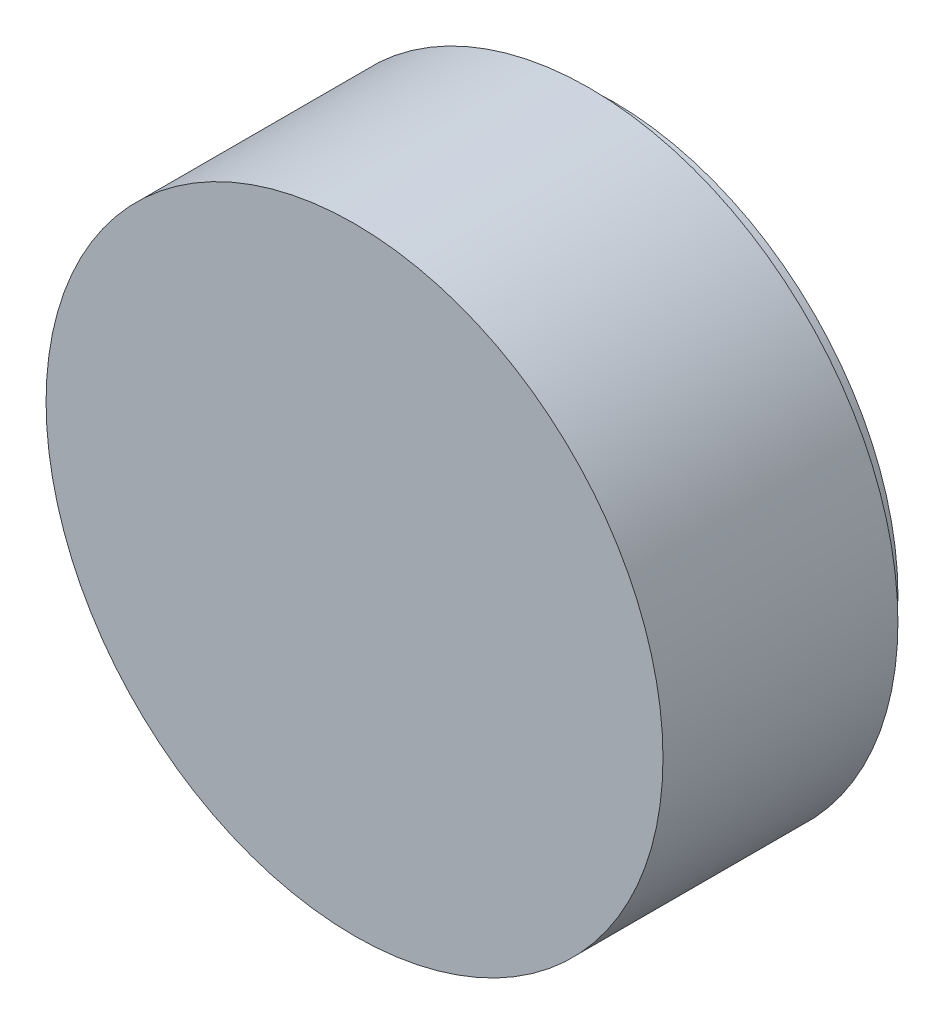
ISO-10303-21;
HEADER;
FILE_DESCRIPTION(('STEP AP214'),'2;1');
FILE_NAME('part.step','',(''),(''),'','','');
FILE_SCHEMA(('AUTOMOTIVE_DESIGN { 1 0 10303 214 1 1 1 1 }'));
ENDSEC;
DATA;
#1=APPLICATION_CONTEXT('core data for automotive mechanical design processes');
#2=APPLICATION_PROTOCOL_DEFINITION('international standard','automotive_design',2000,#1);
#3=PRODUCT_CONTEXT('',#1,'mechanical');
#4=PRODUCT('Part','Part','',(#3));
#5=PRODUCT_RELATED_PRODUCT_CATEGORY('part','',(#4));
#6=PRODUCT_DEFINITION_FORMATION('','',#4);
#7=PRODUCT_DEFINITION_CONTEXT('part definition',#1,'design');
#8=PRODUCT_DEFINITION('design','',#6,#7);
#9=PRODUCT_DEFINITION_SHAPE('','',#8);
#10=(LENGTH_UNIT() NAMED_UNIT(*) SI_UNIT(.MILLI.,.METRE.));
#11=(NAMED_UNIT(*) PLANE_ANGLE_UNIT() SI_UNIT($,.RADIAN.));
#12=(NAMED_UNIT(*) SI_UNIT($,.STERADIAN.) SOLID_ANGLE_UNIT());
#13=UNCERTAINTY_MEASURE_WITH_UNIT(LENGTH_MEASURE(1.E-05),#10,'distance_accuracy_value','');
#14=(GEOMETRIC_REPRESENTATION_CONTEXT(3) GLOBAL_UNCERTAINTY_ASSIGNED_CONTEXT((#13)) GLOBAL_UNIT_ASSIGNED_CONTEXT((#10,
#11,#12)) REPRESENTATION_CONTEXT('',''));
#15=CARTESIAN_POINT('',(0.,0.,0.));
#16=DIRECTION('',(0.,0.,1.));
#17=DIRECTION('',(1.,0.,0.));
#18=AXIS2_PLACEMENT_3D('',#15,#16,#17);
#19=CARTESIAN_POINT('',(0.,0.,2.));
#20=DIRECTION('',(0.,0.,-1.));
#21=DIRECTION('',(-1.,0.,0.));
#22=AXIS2_PLACEMENT_3D('',#19,#20,#21);
#23=CYLINDRICAL_SURFACE('',#22,24.257);
#24=CARTESIAN_POINT('',(0.,0.,2.));
#25=DIRECTION('',(0.,0.,1.));
#26=DIRECTION('',(1.,0.,0.));
#27=AXIS2_PLACEMENT_3D('',#24,#25,#26);
#28=CIRCLE('',#27,24.257);
#29=CARTESIAN_POINT('',(24.257,0.,2.));
#30=VERTEX_POINT('',#29);
#31=EDGE_CURVE('E10',#30,#30,#28,.T.);
#32=ORIENTED_EDGE('',*,*,#31,.F.);
#33=EDGE_LOOP('',(#32));
#34=FACE_BOUND('',#33,.T.);
#35=CARTESIAN_POINT('',(0.,0.,0.));
#36=DIRECTION('',(0.,0.,1.));
#37=DIRECTION('',(1.,0.,0.));
#38=AXIS2_PLACEMENT_3D('',#35,#36,#37);
#39=CIRCLE('',#38,24.257);
#40=CARTESIAN_POINT('',(24.257,0.,0.));
#41=VERTEX_POINT('',#40);
#42=EDGE_CURVE('E36',#41,#41,#39,.T.);
#43=ORIENTED_EDGE('',*,*,#42,.T.);
#44=EDGE_LOOP('',(#43));
#45=FACE_BOUND('',#44,.T.);
#46=ADVANCED_FACE('F33',(#34,#45),#23,.T.);
#47=CARTESIAN_POINT('',(0.,0.,0.));
#48=DIRECTION('',(0.,0.,1.));
#49=DIRECTION('',(1.,0.,0.));
#50=AXIS2_PLACEMENT_3D('',#47,#48,#49);
#51=PLANE('',#50);
#52=ORIENTED_EDGE('',*,*,#42,.F.);
#53=EDGE_LOOP('',(#52));
#54=FACE_BOUND('',#53,.T.);
#55=ADVANCED_FACE('F61',(#54),#51,.F.);
#56=CARTESIAN_POINT('',(0.,0.,2.));
#57=DIRECTION('',(0.,0.,1.));
#58=DIRECTION('',(1.,0.,0.));
#59=AXIS2_PLACEMENT_3D('',#56,#57,#58);
#60=PLANE('',#59);
#61=CARTESIAN_POINT('',(0.,0.,2.));
#62=DIRECTION('',(0.,0.,1.));
#63=DIRECTION('',(1.,0.,0.));
#64=AXIS2_PLACEMENT_3D('',#61,#62,#63);
#65=CIRCLE('',#64,26.257);
#66=CARTESIAN_POINT('',(26.257,0.,2.));
#67=VERTEX_POINT('',#66);
#68=EDGE_CURVE('E45',#67,#67,#65,.T.);
#69=ORIENTED_EDGE('',*,*,#68,.F.);
#70=EDGE_LOOP('',(#69));
#71=FACE_BOUND('',#70,.T.);
#72=ORIENTED_EDGE('',*,*,#31,.T.);
#73=EDGE_LOOP('',(#72));
#74=FACE_BOUND('',#73,.T.);
#75=ADVANCED_FACE('F56',(#71,#74),#60,.F.);
#76=CARTESIAN_POINT('',(0.,0.,22.));
#77=DIRECTION('',(0.,0.,-1.));
#78=DIRECTION('',(-1.,0.,0.));
#79=AXIS2_PLACEMENT_3D('',#76,#77,#78);
#80=CYLINDRICAL_SURFACE('',#79,26.257);
#81=CARTESIAN_POINT('',(0.,0.,22.));
#82=DIRECTION('',(0.,0.,1.));
#83=DIRECTION('',(1.,0.,0.));
#84=AXIS2_PLACEMENT_3D('',#81,#82,#83);
#85=CIRCLE('',#84,26.257);
#86=CARTESIAN_POINT('',(26.257,0.,22.));
#87=VERTEX_POINT('',#86);
#88=EDGE_CURVE('E43',#87,#87,#85,.T.);
#89=ORIENTED_EDGE('',*,*,#88,.F.);
#90=EDGE_LOOP('',(#89));
#91=FACE_BOUND('',#90,.T.);
#92=ORIENTED_EDGE('',*,*,#68,.T.);
#93=EDGE_LOOP('',(#92));
#94=FACE_BOUND('',#93,.T.);
#95=ADVANCED_FACE('F53',(#91,#94),#80,.T.);
#96=CARTESIAN_POINT('',(0.,0.,22.));
#97=DIRECTION('',(0.,0.,1.));
#98=DIRECTION('',(1.,0.,0.));
#99=AXIS2_PLACEMENT_3D('',#96,#97,#98);
#100=PLANE('',#99);
#101=ORIENTED_EDGE('',*,*,#88,.T.);
#102=EDGE_LOOP('',(#101));
#103=FACE_BOUND('',#102,.T.);
#104=ADVANCED_FACE('F51',(#103),#100,.T.);
#105=CLOSED_SHELL('',(#46,#55,#75,#95,#104));
#106=MANIFOLD_SOLID_BREP('B2',#105);
#107=ADVANCED_BREP_SHAPE_REPRESENTATION('',(#18,#106),#14);
#108=SHAPE_DEFINITION_REPRESENTATION(#9,#107);
ENDSEC;
END-ISO-10303-21;
